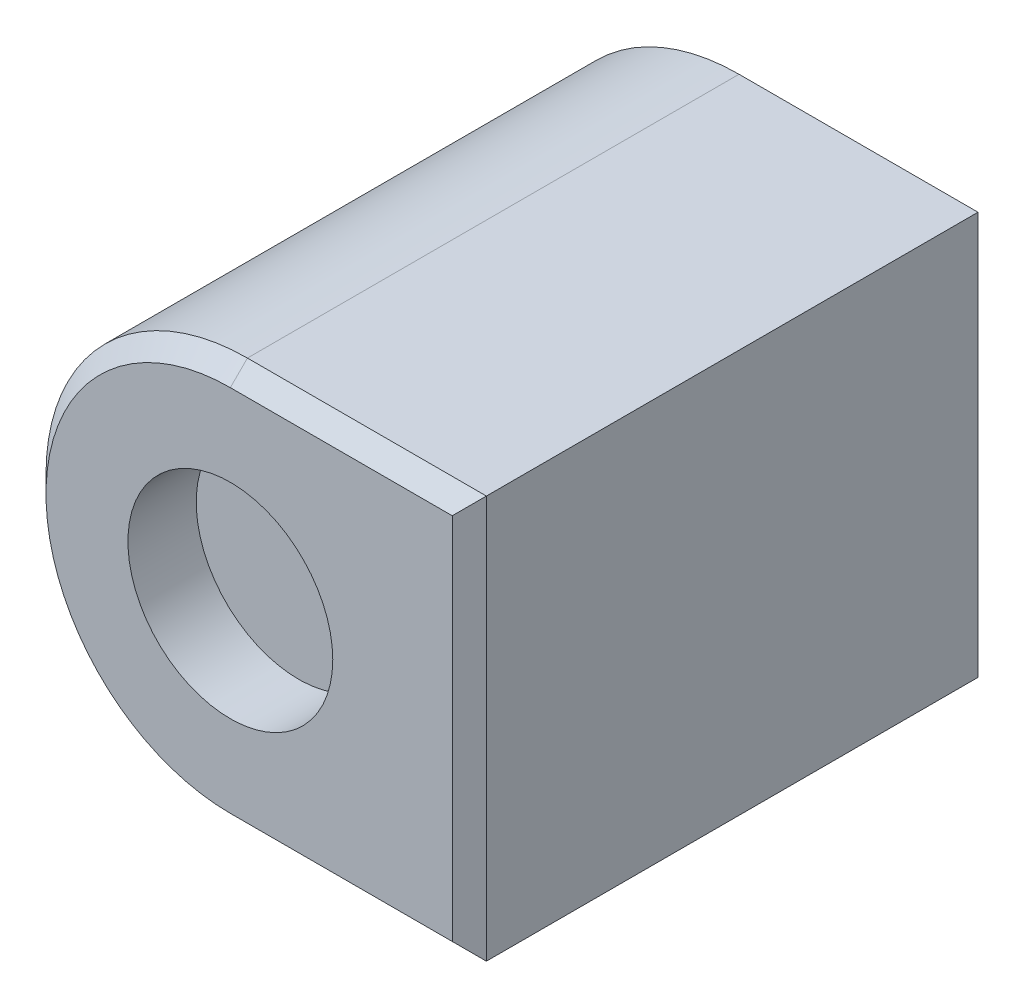
ISO-10303-21;
HEADER;
FILE_DESCRIPTION(('STEP AP214'),'2;1');
FILE_NAME('part.step','',(''),(''),'','','');
FILE_SCHEMA(('AUTOMOTIVE_DESIGN { 1 0 10303 214 1 1 1 1 }'));
ENDSEC;
DATA;
#1=APPLICATION_CONTEXT('core data for automotive mechanical design processes');
#2=APPLICATION_PROTOCOL_DEFINITION('international standard','automotive_design',2000,#1);
#3=PRODUCT_CONTEXT('',#1,'mechanical');
#4=PRODUCT('Part','Part','',(#3));
#5=PRODUCT_RELATED_PRODUCT_CATEGORY('part','',(#4));
#6=PRODUCT_DEFINITION_FORMATION('','',#4);
#7=PRODUCT_DEFINITION_CONTEXT('part definition',#1,'design');
#8=PRODUCT_DEFINITION('design','',#6,#7);
#9=PRODUCT_DEFINITION_SHAPE('','',#8);
#10=(LENGTH_UNIT() NAMED_UNIT(*) SI_UNIT(.MILLI.,.METRE.));
#11=(NAMED_UNIT(*) PLANE_ANGLE_UNIT() SI_UNIT($,.RADIAN.));
#12=(NAMED_UNIT(*) SI_UNIT($,.STERADIAN.) SOLID_ANGLE_UNIT());
#13=UNCERTAINTY_MEASURE_WITH_UNIT(LENGTH_MEASURE(1.E-05),#10,'distance_accuracy_value','');
#14=(GEOMETRIC_REPRESENTATION_CONTEXT(3) GLOBAL_UNCERTAINTY_ASSIGNED_CONTEXT((#13)) GLOBAL_UNIT_ASSIGNED_CONTEXT((#10,
#11,#12)) REPRESENTATION_CONTEXT('',''));
#15=CARTESIAN_POINT('',(0.,0.,0.));
#16=DIRECTION('',(0.,0.,1.));
#17=DIRECTION('',(1.,0.,0.));
#18=AXIS2_PLACEMENT_3D('',#15,#16,#17);
#19=CARTESIAN_POINT('',(0.,0.,149.));
#20=DIRECTION('',(0.,0.,-1.));
#21=DIRECTION('',(-1.,0.,0.));
#22=AXIS2_PLACEMENT_3D('',#19,#20,#21);
#23=CYLINDRICAL_SURFACE('',#22,59.);
#24=DIRECTION('',(0.,0.,-1.));
#25=VECTOR('',#24,1.);
#26=CARTESIAN_POINT('',(0.,-59.,149.));
#27=LINE('',#26,#25);
#28=CARTESIAN_POINT('',(0.,-59.,144.));
#29=VERTEX_POINT('',#28);
#30=CARTESIAN_POINT('',(0.,-59.,0.));
#31=VERTEX_POINT('',#30);
#32=EDGE_CURVE('E101',#29,#31,#27,.T.);
#33=ORIENTED_EDGE('',*,*,#32,.F.);
#34=CARTESIAN_POINT('',(0.,0.,144.));
#35=DIRECTION('',(0.,0.,1.));
#36=DIRECTION('',(1.,0.,0.));
#37=AXIS2_PLACEMENT_3D('',#34,#35,#36);
#38=CIRCLE('',#37,59.);
#39=CARTESIAN_POINT('',(0.,59.,144.));
#40=VERTEX_POINT('',#39);
#41=EDGE_CURVE('E11',#29,#40,#38,.F.);
#42=ORIENTED_EDGE('',*,*,#41,.T.);
#43=DIRECTION('',(0.,0.,-1.));
#44=VECTOR('',#43,1.);
#45=CARTESIAN_POINT('',(0.,59.,149.));
#46=LINE('',#45,#44);
#47=CARTESIAN_POINT('',(0.,59.,0.));
#48=VERTEX_POINT('',#47);
#49=EDGE_CURVE('E123',#40,#48,#46,.T.);
#50=ORIENTED_EDGE('',*,*,#49,.T.);
#51=CARTESIAN_POINT('',(0.,0.,0.));
#52=DIRECTION('',(0.,0.,1.));
#53=DIRECTION('',(1.,0.,0.));
#54=AXIS2_PLACEMENT_3D('',#51,#52,#53);
#55=CIRCLE('',#54,59.);
#56=EDGE_CURVE('E117',#48,#31,#55,.T.);
#57=ORIENTED_EDGE('',*,*,#56,.T.);
#58=EDGE_LOOP('',(#33,#42,#50,#57));
#59=FACE_BOUND('',#58,.T.);
#60=ADVANCED_FACE('F47',(#59),#23,.T.);
#61=CARTESIAN_POINT('',(70.,-59.,149.));
#62=DIRECTION('',(0.,1.,0.));
#63=DIRECTION('',(0.,0.,1.));
#64=AXIS2_PLACEMENT_3D('',#61,#62,#63);
#65=PLANE('',#64);
#66=DIRECTION('',(0.,0.,-1.));
#67=VECTOR('',#66,1.);
#68=CARTESIAN_POINT('',(70.,-59.,149.));
#69=LINE('',#68,#67);
#70=CARTESIAN_POINT('',(70.,-59.,144.));
#71=VERTEX_POINT('',#70);
#72=CARTESIAN_POINT('',(70.,-59.,0.));
#73=VERTEX_POINT('',#72);
#74=EDGE_CURVE('E111',#71,#73,#69,.T.);
#75=ORIENTED_EDGE('',*,*,#74,.F.);
#76=DIRECTION('',(-1.,0.,0.));
#77=VECTOR('',#76,1.);
#78=CARTESIAN_POINT('',(0.,-59.,144.));
#79=LINE('',#78,#77);
#80=EDGE_CURVE('E58',#71,#29,#79,.T.);
#81=ORIENTED_EDGE('',*,*,#80,.T.);
#82=ORIENTED_EDGE('',*,*,#32,.T.);
#83=DIRECTION('',(1.,0.,0.));
#84=VECTOR('',#83,1.);
#85=CARTESIAN_POINT('',(70.,-59.,0.));
#86=LINE('',#85,#84);
#87=EDGE_CURVE('E104',#31,#73,#86,.T.);
#88=ORIENTED_EDGE('',*,*,#87,.T.);
#89=EDGE_LOOP('',(#75,#81,#82,#88));
#90=FACE_BOUND('',#89,.T.);
#91=ADVANCED_FACE('F103',(#90),#65,.F.);
#92=CARTESIAN_POINT('',(70.,59.,149.));
#93=DIRECTION('',(-1.,0.,0.));
#94=DIRECTION('',(0.,0.,1.));
#95=AXIS2_PLACEMENT_3D('',#92,#93,#94);
#96=PLANE('',#95);
#97=DIRECTION('',(0.,0.,-1.));
#98=VECTOR('',#97,1.);
#99=CARTESIAN_POINT('',(70.,59.,149.));
#100=LINE('',#99,#98);
#101=CARTESIAN_POINT('',(70.,59.,144.));
#102=VERTEX_POINT('',#101);
#103=CARTESIAN_POINT('',(70.,59.,0.));
#104=VERTEX_POINT('',#103);
#105=EDGE_CURVE('E141',#102,#104,#100,.T.);
#106=ORIENTED_EDGE('',*,*,#105,.F.);
#107=DIRECTION('',(0.,-1.,0.));
#108=VECTOR('',#107,1.);
#109=CARTESIAN_POINT('',(70.,-59.,144.));
#110=LINE('',#109,#108);
#111=EDGE_CURVE('E73',#102,#71,#110,.T.);
#112=ORIENTED_EDGE('',*,*,#111,.T.);
#113=ORIENTED_EDGE('',*,*,#74,.T.);
#114=DIRECTION('',(0.,1.,0.));
#115=VECTOR('',#114,1.);
#116=CARTESIAN_POINT('',(70.,59.,0.));
#117=LINE('',#116,#115);
#118=EDGE_CURVE('E119',#73,#104,#117,.T.);
#119=ORIENTED_EDGE('',*,*,#118,.T.);
#120=EDGE_LOOP('',(#106,#112,#113,#119));
#121=FACE_BOUND('',#120,.T.);
#122=ADVANCED_FACE('F192',(#121),#96,.F.);
#123=CARTESIAN_POINT('',(0.,59.,149.));
#124=DIRECTION('',(0.,-1.,0.));
#125=DIRECTION('',(0.,0.,-1.));
#126=AXIS2_PLACEMENT_3D('',#123,#124,#125);
#127=PLANE('',#126);
#128=ORIENTED_EDGE('',*,*,#49,.F.);
#129=DIRECTION('',(1.,0.,0.));
#130=VECTOR('',#129,1.);
#131=CARTESIAN_POINT('',(70.,59.,144.));
#132=LINE('',#131,#130);
#133=EDGE_CURVE('E158',#40,#102,#132,.T.);
#134=ORIENTED_EDGE('',*,*,#133,.T.);
#135=ORIENTED_EDGE('',*,*,#105,.T.);
#136=DIRECTION('',(-1.,0.,0.));
#137=VECTOR('',#136,1.);
#138=CARTESIAN_POINT('',(0.,59.,0.));
#139=LINE('',#138,#137);
#140=EDGE_CURVE('E136',#104,#48,#139,.T.);
#141=ORIENTED_EDGE('',*,*,#140,.T.);
#142=EDGE_LOOP('',(#128,#134,#135,#141));
#143=FACE_BOUND('',#142,.T.);
#144=ADVANCED_FACE('F191',(#143),#127,.F.);
#145=CARTESIAN_POINT('',(0.,0.,149.));
#146=DIRECTION('',(0.,0.,1.));
#147=DIRECTION('',(1.,0.,0.));
#148=AXIS2_PLACEMENT_3D('',#145,#146,#147);
#149=PLANE('',#148);
#150=CARTESIAN_POINT('',(0.,0.,149.));
#151=DIRECTION('',(0.,0.,1.));
#152=DIRECTION('',(1.,0.,0.));
#153=AXIS2_PLACEMENT_3D('',#150,#151,#152);
#154=CIRCLE('',#153,30.);
#155=CARTESIAN_POINT('',(30.,0.,149.));
#156=VERTEX_POINT('',#155);
#157=EDGE_CURVE('E131',#156,#156,#154,.T.);
#158=ORIENTED_EDGE('',*,*,#157,.F.);
#159=EDGE_LOOP('',(#158));
#160=FACE_BOUND('',#159,.T.);
#161=DIRECTION('',(0.,1.,0.));
#162=VECTOR('',#161,1.);
#163=CARTESIAN_POINT('',(65.,59.,149.));
#164=LINE('',#163,#162);
#165=CARTESIAN_POINT('',(65.,-54.,149.));
#166=VERTEX_POINT('',#165);
#167=CARTESIAN_POINT('',(65.,54.,149.));
#168=VERTEX_POINT('',#167);
#169=EDGE_CURVE('E151',#166,#168,#164,.T.);
#170=ORIENTED_EDGE('',*,*,#169,.T.);
#171=DIRECTION('',(-1.,0.,0.));
#172=VECTOR('',#171,1.);
#173=CARTESIAN_POINT('',(0.,54.,149.));
#174=LINE('',#173,#172);
#175=CARTESIAN_POINT('',(0.,54.,149.));
#176=VERTEX_POINT('',#175);
#177=EDGE_CURVE('E154',#168,#176,#174,.T.);
#178=ORIENTED_EDGE('',*,*,#177,.T.);
#179=CARTESIAN_POINT('',(0.,0.,149.));
#180=DIRECTION('',(0.,0.,1.));
#181=DIRECTION('',(1.,0.,0.));
#182=AXIS2_PLACEMENT_3D('',#179,#180,#181);
#183=CIRCLE('',#182,54.);
#184=CARTESIAN_POINT('',(0.,-54.,149.));
#185=VERTEX_POINT('',#184);
#186=EDGE_CURVE('E110',#176,#185,#183,.T.);
#187=ORIENTED_EDGE('',*,*,#186,.T.);
#188=DIRECTION('',(1.,0.,0.));
#189=VECTOR('',#188,1.);
#190=CARTESIAN_POINT('',(70.,-54.,149.));
#191=LINE('',#190,#189);
#192=EDGE_CURVE('E148',#185,#166,#191,.T.);
#193=ORIENTED_EDGE('',*,*,#192,.T.);
#194=EDGE_LOOP('',(#170,#178,#187,#193));
#195=FACE_BOUND('',#194,.T.);
#196=ADVANCED_FACE('F184',(#160,#195),#149,.T.);
#197=CARTESIAN_POINT('',(0.,0.,0.));
#198=DIRECTION('',(0.,0.,1.));
#199=DIRECTION('',(1.,0.,0.));
#200=AXIS2_PLACEMENT_3D('',#197,#198,#199);
#201=PLANE('',#200);
#202=ORIENTED_EDGE('',*,*,#56,.F.);
#203=ORIENTED_EDGE('',*,*,#140,.F.);
#204=ORIENTED_EDGE('',*,*,#118,.F.);
#205=ORIENTED_EDGE('',*,*,#87,.F.);
#206=EDGE_LOOP('',(#202,#203,#204,#205));
#207=FACE_BOUND('',#206,.T.);
#208=ADVANCED_FACE('F115',(#207),#201,.F.);
#209=CARTESIAN_POINT('',(0.,-54.,149.));
#210=DIRECTION('',(0.,-0.707106781186547,0.707106781186547));
#211=DIRECTION('',(-1.,0.,0.));
#212=AXIS2_PLACEMENT_3D('',#209,#210,#211);
#213=PLANE('',#212);
#214=DIRECTION('',(0.,0.707106781186547,0.707106781186547));
#215=VECTOR('',#214,1.);
#216=CARTESIAN_POINT('',(0.,-59.,144.));
#217=LINE('',#216,#215);
#218=EDGE_CURVE('E129',#29,#185,#217,.T.);
#219=ORIENTED_EDGE('',*,*,#218,.F.);
#220=ORIENTED_EDGE('',*,*,#80,.F.);
#221=DIRECTION('',(-0.577350269189626,0.577350269189626,0.577350269189626));
#222=VECTOR('',#221,1.);
#223=CARTESIAN_POINT('',(43.3333333333333,-32.3333333333333,170.666666666667));
#224=LINE('',#223,#222);
#225=EDGE_CURVE('E52',#166,#71,#224,.F.);
#226=ORIENTED_EDGE('',*,*,#225,.F.);
#227=ORIENTED_EDGE('',*,*,#192,.F.);
#228=EDGE_LOOP('',(#219,#220,#226,#227));
#229=FACE_BOUND('',#228,.T.);
#230=ADVANCED_FACE('F50',(#229),#213,.T.);
#231=CARTESIAN_POINT('',(65.,0.,149.));
#232=DIRECTION('',(0.707106781186547,0.,0.707106781186547));
#233=DIRECTION('',(0.,-1.,0.));
#234=AXIS2_PLACEMENT_3D('',#231,#232,#233);
#235=PLANE('',#234);
#236=ORIENTED_EDGE('',*,*,#225,.T.);
#237=ORIENTED_EDGE('',*,*,#111,.F.);
#238=DIRECTION('',(-0.577350269189626,-0.577350269189626,0.577350269189626));
#239=VECTOR('',#238,1.);
#240=CARTESIAN_POINT('',(47.,36.,167.));
#241=LINE('',#240,#239);
#242=EDGE_CURVE('E169',#168,#102,#241,.F.);
#243=ORIENTED_EDGE('',*,*,#242,.F.);
#244=ORIENTED_EDGE('',*,*,#169,.F.);
#245=EDGE_LOOP('',(#236,#237,#243,#244));
#246=FACE_BOUND('',#245,.T.);
#247=ADVANCED_FACE('F218',(#246),#235,.T.);
#248=CARTESIAN_POINT('',(0.,0.,149.));
#249=DIRECTION('',(0.,0.,-1.));
#250=DIRECTION('',(-1.,0.,0.));
#251=AXIS2_PLACEMENT_3D('',#248,#249,#250);
#252=CONICAL_SURFACE('',#251,54.,0.785398163397448);
#253=ORIENTED_EDGE('',*,*,#218,.T.);
#254=ORIENTED_EDGE('',*,*,#186,.F.);
#255=DIRECTION('',(0.,-0.707106781186547,0.707106781186547));
#256=VECTOR('',#255,1.);
#257=CARTESIAN_POINT('',(0.,59.,144.));
#258=LINE('',#257,#256);
#259=EDGE_CURVE('E166',#40,#176,#258,.T.);
#260=ORIENTED_EDGE('',*,*,#259,.F.);
#261=ORIENTED_EDGE('',*,*,#41,.F.);
#262=EDGE_LOOP('',(#253,#254,#260,#261));
#263=FACE_BOUND('',#262,.T.);
#264=ADVANCED_FACE('F177',(#263),#252,.T.);
#265=CARTESIAN_POINT('',(0.,54.,149.));
#266=DIRECTION('',(0.,0.707106781186547,0.707106781186547));
#267=DIRECTION('',(1.,0.,0.));
#268=AXIS2_PLACEMENT_3D('',#265,#266,#267);
#269=PLANE('',#268);
#270=ORIENTED_EDGE('',*,*,#242,.T.);
#271=ORIENTED_EDGE('',*,*,#133,.F.);
#272=ORIENTED_EDGE('',*,*,#259,.T.);
#273=ORIENTED_EDGE('',*,*,#177,.F.);
#274=EDGE_LOOP('',(#270,#271,#272,#273));
#275=FACE_BOUND('',#274,.T.);
#276=ADVANCED_FACE('F188',(#275),#269,.T.);
#277=CARTESIAN_POINT('',(0.,0.,129.));
#278=DIRECTION('',(0.,0.,1.));
#279=DIRECTION('',(1.,0.,0.));
#280=AXIS2_PLACEMENT_3D('',#277,#278,#279);
#281=CYLINDRICAL_SURFACE('',#280,30.);
#282=CARTESIAN_POINT('',(0.,0.,129.));
#283=DIRECTION('',(0.,0.,1.));
#284=DIRECTION('',(1.,0.,0.));
#285=AXIS2_PLACEMENT_3D('',#282,#283,#284);
#286=CIRCLE('',#285,30.);
#287=CARTESIAN_POINT('',(30.,0.,129.));
#288=VERTEX_POINT('',#287);
#289=EDGE_CURVE('E170',#288,#288,#286,.T.);
#290=ORIENTED_EDGE('',*,*,#289,.F.);
#291=EDGE_LOOP('',(#290));
#292=FACE_BOUND('',#291,.T.);
#293=ORIENTED_EDGE('',*,*,#157,.T.);
#294=EDGE_LOOP('',(#293));
#295=FACE_BOUND('',#294,.T.);
#296=ADVANCED_FACE('F213',(#292,#295),#281,.F.);
#297=CARTESIAN_POINT('',(0.,0.,129.));
#298=DIRECTION('',(0.,0.,1.));
#299=DIRECTION('',(1.,0.,0.));
#300=AXIS2_PLACEMENT_3D('',#297,#298,#299);
#301=PLANE('',#300);
#302=ORIENTED_EDGE('',*,*,#289,.T.);
#303=EDGE_LOOP('',(#302));
#304=FACE_BOUND('',#303,.T.);
#305=ADVANCED_FACE('F237',(#304),#301,.T.);
#306=CLOSED_SHELL('',(#60,#91,#122,#144,#196,#208,#230,#247,#264,#276,#296,#305));
#307=MANIFOLD_SOLID_BREP('B2',#306);
#308=ADVANCED_BREP_SHAPE_REPRESENTATION('',(#18,#307),#14);
#309=SHAPE_DEFINITION_REPRESENTATION(#9,#308);
ENDSEC;
END-ISO-10303-21;
